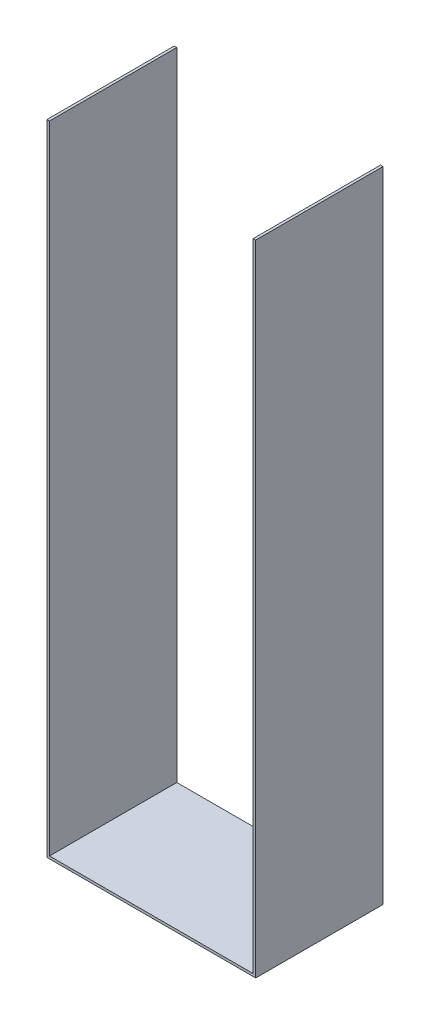
ISO-10303-21;
HEADER;
FILE_DESCRIPTION(('STEP AP214'),'2;1');
FILE_NAME('part.step','',(''),(''),'','','');
FILE_SCHEMA(('AUTOMOTIVE_DESIGN { 1 0 10303 214 1 1 1 1 }'));
ENDSEC;
DATA;
#1=APPLICATION_CONTEXT('core data for automotive mechanical design processes');
#2=APPLICATION_PROTOCOL_DEFINITION('international standard','automotive_design',2000,#1);
#3=PRODUCT_CONTEXT('',#1,'mechanical');
#4=PRODUCT('Part','Part','',(#3));
#5=PRODUCT_RELATED_PRODUCT_CATEGORY('part','',(#4));
#6=PRODUCT_DEFINITION_FORMATION('','',#4);
#7=PRODUCT_DEFINITION_CONTEXT('part definition',#1,'design');
#8=PRODUCT_DEFINITION('design','',#6,#7);
#9=PRODUCT_DEFINITION_SHAPE('','',#8);
#10=(LENGTH_UNIT() NAMED_UNIT(*) SI_UNIT(.MILLI.,.METRE.));
#11=(NAMED_UNIT(*) PLANE_ANGLE_UNIT() SI_UNIT($,.RADIAN.));
#12=(NAMED_UNIT(*) SI_UNIT($,.STERADIAN.) SOLID_ANGLE_UNIT());
#13=UNCERTAINTY_MEASURE_WITH_UNIT(LENGTH_MEASURE(1.E-05),#10,'distance_accuracy_value','');
#14=(GEOMETRIC_REPRESENTATION_CONTEXT(3) GLOBAL_UNCERTAINTY_ASSIGNED_CONTEXT((#13)) GLOBAL_UNIT_ASSIGNED_CONTEXT((#10,
#11,#12)) REPRESENTATION_CONTEXT('',''));
#15=CARTESIAN_POINT('',(0.,0.,0.));
#16=DIRECTION('',(0.,0.,1.));
#17=DIRECTION('',(1.,0.,0.));
#18=AXIS2_PLACEMENT_3D('',#15,#16,#17);
#19=CARTESIAN_POINT('',(-200.,0.,-10000.));
#20=DIRECTION('',(0.,1.,0.));
#21=DIRECTION('',(0.,0.,1.));
#22=AXIS2_PLACEMENT_3D('',#19,#20,#21);
#23=PLANE('',#22);
#24=DIRECTION('',(-1.,0.,0.));
#25=VECTOR('',#24,1.);
#26=CARTESIAN_POINT('',(-200.,0.,0.));
#27=LINE('',#26,#25);
#28=CARTESIAN_POINT('',(0.,0.,0.));
#29=VERTEX_POINT('',#28);
#30=CARTESIAN_POINT('',(-200.,0.,0.));
#31=VERTEX_POINT('',#30);
#32=EDGE_CURVE('E146',#29,#31,#27,.T.);
#33=ORIENTED_EDGE('',*,*,#32,.F.);
#34=DIRECTION('',(0.,0.,1.));
#35=VECTOR('',#34,1.);
#36=CARTESIAN_POINT('',(0.,0.,-10000.));
#37=LINE('',#36,#35);
#38=CARTESIAN_POINT('',(0.,0.,-10000.));
#39=VERTEX_POINT('',#38);
#40=EDGE_CURVE('E11',#39,#29,#37,.T.);
#41=ORIENTED_EDGE('',*,*,#40,.F.);
#42=DIRECTION('',(-1.,0.,0.));
#43=VECTOR('',#42,1.);
#44=CARTESIAN_POINT('',(-200.,0.,-10000.));
#45=LINE('',#44,#43);
#46=CARTESIAN_POINT('',(-200.,0.,-10000.));
#47=VERTEX_POINT('',#46);
#48=EDGE_CURVE('E174',#39,#47,#45,.T.);
#49=ORIENTED_EDGE('',*,*,#48,.T.);
#50=DIRECTION('',(0.,0.,1.));
#51=VECTOR('',#50,1.);
#52=CARTESIAN_POINT('',(-200.,0.,-10000.));
#53=LINE('',#52,#51);
#54=EDGE_CURVE('E46',#47,#31,#53,.T.);
#55=ORIENTED_EDGE('',*,*,#54,.T.);
#56=EDGE_LOOP('',(#33,#41,#49,#55));
#57=FACE_BOUND('',#56,.T.);
#58=ADVANCED_FACE('F43',(#57),#23,.T.);
#59=CARTESIAN_POINT('',(0.,0.,-10000.));
#60=DIRECTION('',(1.,0.,0.));
#61=DIRECTION('',(0.,1.,0.));
#62=AXIS2_PLACEMENT_3D('',#59,#60,#61);
#63=PLANE('',#62);
#64=DIRECTION('',(0.,1.,0.));
#65=VECTOR('',#64,1.);
#66=CARTESIAN_POINT('',(0.,0.,0.));
#67=LINE('',#66,#65);
#68=CARTESIAN_POINT('',(6.12323399573677E-12,-50000.,0.));
#69=VERTEX_POINT('',#68);
#70=EDGE_CURVE('E171',#69,#29,#67,.T.);
#71=ORIENTED_EDGE('',*,*,#70,.F.);
#72=DIRECTION('',(0.,0.,1.));
#73=VECTOR('',#72,1.);
#74=CARTESIAN_POINT('',(6.12323399573677E-12,-50000.,-10000.));
#75=LINE('',#74,#73);
#76=CARTESIAN_POINT('',(6.12323399573677E-12,-50000.,-10000.));
#77=VERTEX_POINT('',#76);
#78=EDGE_CURVE('E53',#77,#69,#75,.T.);
#79=ORIENTED_EDGE('',*,*,#78,.F.);
#80=DIRECTION('',(0.,1.,0.));
#81=VECTOR('',#80,1.);
#82=CARTESIAN_POINT('',(0.,0.,-10000.));
#83=LINE('',#82,#81);
#84=EDGE_CURVE('E132',#77,#39,#83,.T.);
#85=ORIENTED_EDGE('',*,*,#84,.T.);
#86=ORIENTED_EDGE('',*,*,#40,.T.);
#87=EDGE_LOOP('',(#71,#79,#85,#86));
#88=FACE_BOUND('',#87,.T.);
#89=ADVANCED_FACE('F192',(#88),#63,.T.);
#90=CARTESIAN_POINT('',(6.12323399573677E-12,-50000.,-10000.));
#91=DIRECTION('',(0.,1.,0.));
#92=DIRECTION('',(0.,0.,1.));
#93=AXIS2_PLACEMENT_3D('',#90,#91,#92);
#94=PLANE('',#93);
#95=DIRECTION('',(-1.,0.,0.));
#96=VECTOR('',#95,1.);
#97=CARTESIAN_POINT('',(6.12323399573677E-12,-50000.,0.));
#98=LINE('',#97,#96);
#99=CARTESIAN_POINT('',(16000.,-50000.,0.));
#100=VERTEX_POINT('',#99);
#101=EDGE_CURVE('E118',#100,#69,#98,.T.);
#102=ORIENTED_EDGE('',*,*,#101,.F.);
#103=DIRECTION('',(0.,0.,1.));
#104=VECTOR('',#103,1.);
#105=CARTESIAN_POINT('',(16000.,-50000.,-10000.));
#106=LINE('',#105,#104);
#107=CARTESIAN_POINT('',(16000.,-50000.,-10000.));
#108=VERTEX_POINT('',#107);
#109=EDGE_CURVE('E113',#108,#100,#106,.T.);
#110=ORIENTED_EDGE('',*,*,#109,.F.);
#111=DIRECTION('',(-1.,0.,0.));
#112=VECTOR('',#111,1.);
#113=CARTESIAN_POINT('',(6.12323399573677E-12,-50000.,-10000.));
#114=LINE('',#113,#112);
#115=EDGE_CURVE('E116',#108,#77,#114,.T.);
#116=ORIENTED_EDGE('',*,*,#115,.T.);
#117=ORIENTED_EDGE('',*,*,#78,.T.);
#118=EDGE_LOOP('',(#102,#110,#116,#117));
#119=FACE_BOUND('',#118,.T.);
#120=ADVANCED_FACE('F115',(#119),#94,.T.);
#121=CARTESIAN_POINT('',(16000.,-50000.,-10000.));
#122=DIRECTION('',(-1.,0.,0.));
#123=DIRECTION('',(0.,0.,1.));
#124=AXIS2_PLACEMENT_3D('',#121,#122,#123);
#125=PLANE('',#124);
#126=DIRECTION('',(0.,-1.,0.));
#127=VECTOR('',#126,1.);
#128=CARTESIAN_POINT('',(16000.,-50000.,0.));
#129=LINE('',#128,#127);
#130=CARTESIAN_POINT('',(16000.,0.,0.));
#131=VERTEX_POINT('',#130);
#132=EDGE_CURVE('E166',#131,#100,#129,.T.);
#133=ORIENTED_EDGE('',*,*,#132,.F.);
#134=DIRECTION('',(0.,0.,1.));
#135=VECTOR('',#134,1.);
#136=CARTESIAN_POINT('',(16000.,0.,-10000.));
#137=LINE('',#136,#135);
#138=CARTESIAN_POINT('',(16000.,0.,-10000.));
#139=VERTEX_POINT('',#138);
#140=EDGE_CURVE('E124',#139,#131,#137,.T.);
#141=ORIENTED_EDGE('',*,*,#140,.F.);
#142=DIRECTION('',(0.,-1.,0.));
#143=VECTOR('',#142,1.);
#144=CARTESIAN_POINT('',(16000.,-50000.,-10000.));
#145=LINE('',#144,#143);
#146=EDGE_CURVE('E130',#139,#108,#145,.T.);
#147=ORIENTED_EDGE('',*,*,#146,.T.);
#148=ORIENTED_EDGE('',*,*,#109,.T.);
#149=EDGE_LOOP('',(#133,#141,#147,#148));
#150=FACE_BOUND('',#149,.T.);
#151=ADVANCED_FACE('F135',(#150),#125,.T.);
#152=CARTESIAN_POINT('',(16000.,0.,-10000.));
#153=DIRECTION('',(0.,1.,0.));
#154=DIRECTION('',(0.,0.,1.));
#155=AXIS2_PLACEMENT_3D('',#152,#153,#154);
#156=PLANE('',#155);
#157=DIRECTION('',(-1.,0.,0.));
#158=VECTOR('',#157,1.);
#159=CARTESIAN_POINT('',(16000.,0.,0.));
#160=LINE('',#159,#158);
#161=CARTESIAN_POINT('',(16200.,0.,0.));
#162=VERTEX_POINT('',#161);
#163=EDGE_CURVE('E162',#162,#131,#160,.T.);
#164=ORIENTED_EDGE('',*,*,#163,.F.);
#165=DIRECTION('',(0.,0.,1.));
#166=VECTOR('',#165,1.);
#167=CARTESIAN_POINT('',(16200.,0.,-10000.));
#168=LINE('',#167,#166);
#169=CARTESIAN_POINT('',(16200.,0.,-10000.));
#170=VERTEX_POINT('',#169);
#171=EDGE_CURVE('E180',#170,#162,#168,.T.);
#172=ORIENTED_EDGE('',*,*,#171,.F.);
#173=DIRECTION('',(-1.,0.,0.));
#174=VECTOR('',#173,1.);
#175=CARTESIAN_POINT('',(16000.,0.,-10000.));
#176=LINE('',#175,#174);
#177=EDGE_CURVE('E137',#170,#139,#176,.T.);
#178=ORIENTED_EDGE('',*,*,#177,.T.);
#179=ORIENTED_EDGE('',*,*,#140,.T.);
#180=EDGE_LOOP('',(#164,#172,#178,#179));
#181=FACE_BOUND('',#180,.T.);
#182=ADVANCED_FACE('F205',(#181),#156,.T.);
#183=CARTESIAN_POINT('',(16200.,-50200.,-10000.));
#184=DIRECTION('',(1.,0.,0.));
#185=DIRECTION('',(0.,0.,-1.));
#186=AXIS2_PLACEMENT_3D('',#183,#184,#185);
#187=PLANE('',#186);
#188=DIRECTION('',(0.,1.,0.));
#189=VECTOR('',#188,1.);
#190=CARTESIAN_POINT('',(16200.,-50200.,0.));
#191=LINE('',#190,#189);
#192=CARTESIAN_POINT('',(16200.,-50200.,0.));
#193=VERTEX_POINT('',#192);
#194=EDGE_CURVE('E158',#193,#162,#191,.T.);
#195=ORIENTED_EDGE('',*,*,#194,.F.);
#196=DIRECTION('',(0.,0.,1.));
#197=VECTOR('',#196,1.);
#198=CARTESIAN_POINT('',(16200.,-50200.,-10000.));
#199=LINE('',#198,#197);
#200=CARTESIAN_POINT('',(16200.,-50200.,-10000.));
#201=VERTEX_POINT('',#200);
#202=EDGE_CURVE('E183',#201,#193,#199,.T.);
#203=ORIENTED_EDGE('',*,*,#202,.F.);
#204=DIRECTION('',(0.,1.,0.));
#205=VECTOR('',#204,1.);
#206=CARTESIAN_POINT('',(16200.,-50200.,-10000.));
#207=LINE('',#206,#205);
#208=EDGE_CURVE('E140',#201,#170,#207,.T.);
#209=ORIENTED_EDGE('',*,*,#208,.T.);
#210=ORIENTED_EDGE('',*,*,#171,.T.);
#211=EDGE_LOOP('',(#195,#203,#209,#210));
#212=FACE_BOUND('',#211,.T.);
#213=ADVANCED_FACE('F208',(#212),#187,.T.);
#214=CARTESIAN_POINT('',(-199.999999999993,-50200.,-10000.));
#215=DIRECTION('',(0.,-1.,0.));
#216=DIRECTION('',(0.,0.,-1.));
#217=AXIS2_PLACEMENT_3D('',#214,#215,#216);
#218=PLANE('',#217);
#219=DIRECTION('',(1.,0.,0.));
#220=VECTOR('',#219,1.);
#221=CARTESIAN_POINT('',(-199.999999999993,-50200.,0.));
#222=LINE('',#221,#220);
#223=CARTESIAN_POINT('',(-199.999999999993,-50200.,0.));
#224=VERTEX_POINT('',#223);
#225=EDGE_CURVE('E154',#224,#193,#222,.T.);
#226=ORIENTED_EDGE('',*,*,#225,.F.);
#227=DIRECTION('',(0.,0.,1.));
#228=VECTOR('',#227,1.);
#229=CARTESIAN_POINT('',(-199.999999999993,-50200.,-10000.));
#230=LINE('',#229,#228);
#231=CARTESIAN_POINT('',(-199.999999999993,-50200.,-10000.));
#232=VERTEX_POINT('',#231);
#233=EDGE_CURVE('E185',#232,#224,#230,.T.);
#234=ORIENTED_EDGE('',*,*,#233,.F.);
#235=DIRECTION('',(1.,0.,0.));
#236=VECTOR('',#235,1.);
#237=CARTESIAN_POINT('',(-199.999999999993,-50200.,-10000.));
#238=LINE('',#237,#236);
#239=EDGE_CURVE('E303',#232,#201,#238,.T.);
#240=ORIENTED_EDGE('',*,*,#239,.T.);
#241=ORIENTED_EDGE('',*,*,#202,.T.);
#242=EDGE_LOOP('',(#226,#234,#240,#241));
#243=FACE_BOUND('',#242,.T.);
#244=ADVANCED_FACE('F212',(#243),#218,.T.);
#245=CARTESIAN_POINT('',(-200.,0.,-10000.));
#246=DIRECTION('',(-1.,0.,0.));
#247=DIRECTION('',(0.,-1.,0.));
#248=AXIS2_PLACEMENT_3D('',#245,#246,#247);
#249=PLANE('',#248);
#250=DIRECTION('',(0.,-1.,0.));
#251=VECTOR('',#250,1.);
#252=CARTESIAN_POINT('',(-200.,0.,0.));
#253=LINE('',#252,#251);
#254=EDGE_CURVE('E150',#31,#224,#253,.T.);
#255=ORIENTED_EDGE('',*,*,#254,.F.);
#256=ORIENTED_EDGE('',*,*,#54,.F.);
#257=DIRECTION('',(0.,-1.,0.));
#258=VECTOR('',#257,1.);
#259=CARTESIAN_POINT('',(-200.,0.,-10000.));
#260=LINE('',#259,#258);
#261=EDGE_CURVE('E306',#47,#232,#260,.T.);
#262=ORIENTED_EDGE('',*,*,#261,.T.);
#263=ORIENTED_EDGE('',*,*,#233,.T.);
#264=EDGE_LOOP('',(#255,#256,#262,#263));
#265=FACE_BOUND('',#264,.T.);
#266=ADVANCED_FACE('F189',(#265),#249,.T.);
#267=CARTESIAN_POINT('',(0.,0.,-10000.));
#268=DIRECTION('',(0.,0.,-1.));
#269=DIRECTION('',(-1.,0.,0.));
#270=AXIS2_PLACEMENT_3D('',#267,#268,#269);
#271=PLANE('',#270);
#272=ORIENTED_EDGE('',*,*,#48,.F.);
#273=ORIENTED_EDGE('',*,*,#84,.F.);
#274=ORIENTED_EDGE('',*,*,#115,.F.);
#275=ORIENTED_EDGE('',*,*,#146,.F.);
#276=ORIENTED_EDGE('',*,*,#177,.F.);
#277=ORIENTED_EDGE('',*,*,#208,.F.);
#278=ORIENTED_EDGE('',*,*,#239,.F.);
#279=ORIENTED_EDGE('',*,*,#261,.F.);
#280=EDGE_LOOP('',(#272,#273,#274,#275,#276,#277,#278,#279));
#281=FACE_BOUND('',#280,.T.);
#282=ADVANCED_FACE('F128',(#281),#271,.T.);
#283=CARTESIAN_POINT('',(0.,0.,0.));
#284=DIRECTION('',(0.,0.,-1.));
#285=DIRECTION('',(-1.,0.,0.));
#286=AXIS2_PLACEMENT_3D('',#283,#284,#285);
#287=PLANE('',#286);
#288=ORIENTED_EDGE('',*,*,#32,.T.);
#289=ORIENTED_EDGE('',*,*,#254,.T.);
#290=ORIENTED_EDGE('',*,*,#225,.T.);
#291=ORIENTED_EDGE('',*,*,#194,.T.);
#292=ORIENTED_EDGE('',*,*,#163,.T.);
#293=ORIENTED_EDGE('',*,*,#132,.T.);
#294=ORIENTED_EDGE('',*,*,#101,.T.);
#295=ORIENTED_EDGE('',*,*,#70,.T.);
#296=EDGE_LOOP('',(#288,#289,#290,#291,#292,#293,#294,#295));
#297=FACE_BOUND('',#296,.T.);
#298=ADVANCED_FACE('F191',(#297),#287,.F.);
#299=CLOSED_SHELL('',(#58,#89,#120,#151,#182,#213,#244,#266,#282,#298));
#300=MANIFOLD_SOLID_BREP('B2',#299);
#301=ADVANCED_BREP_SHAPE_REPRESENTATION('',(#18,#300),#14);
#302=SHAPE_DEFINITION_REPRESENTATION(#9,#301);
ENDSEC;
END-ISO-10303-21;
